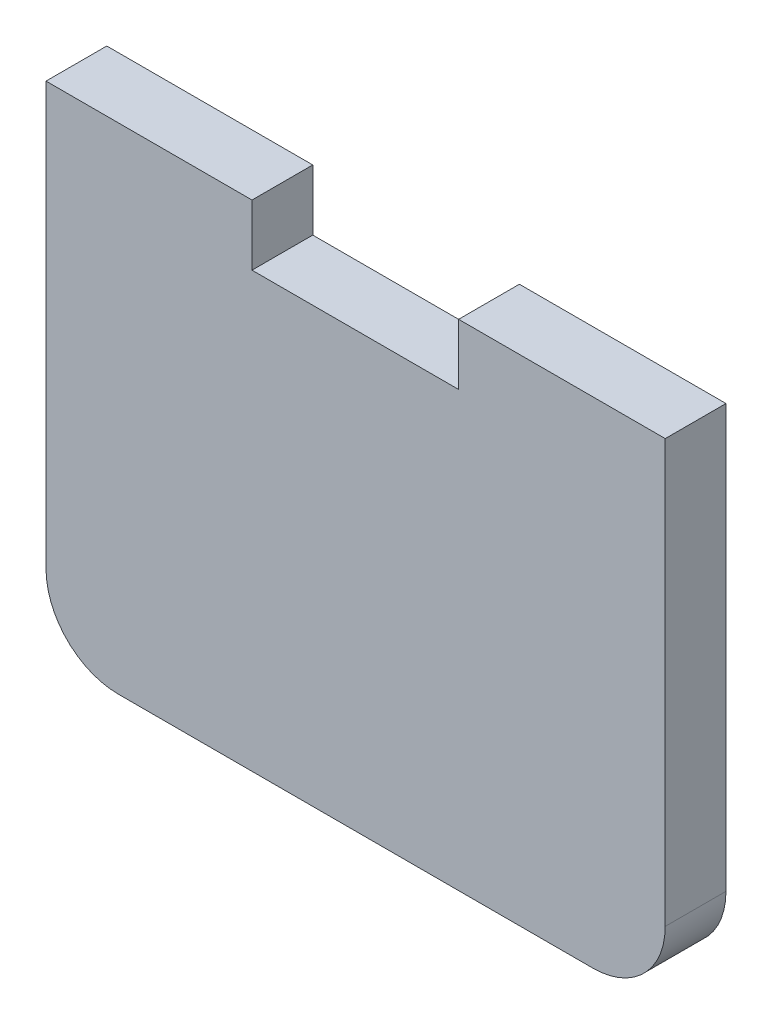
ISO-10303-21;
HEADER;
FILE_DESCRIPTION(('STEP AP214'),'2;1');
FILE_NAME('part.step','',(''),(''),'','','');
FILE_SCHEMA(('AUTOMOTIVE_DESIGN { 1 0 10303 214 1 1 1 1 }'));
ENDSEC;
DATA;
#1=APPLICATION_CONTEXT('core data for automotive mechanical design processes');
#2=APPLICATION_PROTOCOL_DEFINITION('international standard','automotive_design',2000,#1);
#3=PRODUCT_CONTEXT('',#1,'mechanical');
#4=PRODUCT('Part','Part','',(#3));
#5=PRODUCT_RELATED_PRODUCT_CATEGORY('part','',(#4));
#6=PRODUCT_DEFINITION_FORMATION('','',#4);
#7=PRODUCT_DEFINITION_CONTEXT('part definition',#1,'design');
#8=PRODUCT_DEFINITION('design','',#6,#7);
#9=PRODUCT_DEFINITION_SHAPE('','',#8);
#10=(LENGTH_UNIT() NAMED_UNIT(*) SI_UNIT(.MILLI.,.METRE.));
#11=(NAMED_UNIT(*) PLANE_ANGLE_UNIT() SI_UNIT($,.RADIAN.));
#12=(NAMED_UNIT(*) SI_UNIT($,.STERADIAN.) SOLID_ANGLE_UNIT());
#13=UNCERTAINTY_MEASURE_WITH_UNIT(LENGTH_MEASURE(1.E-05),#10,'distance_accuracy_value','');
#14=(GEOMETRIC_REPRESENTATION_CONTEXT(3) GLOBAL_UNCERTAINTY_ASSIGNED_CONTEXT((#13)) GLOBAL_UNIT_ASSIGNED_CONTEXT((#10,
#11,#12)) REPRESENTATION_CONTEXT('',''));
#15=CARTESIAN_POINT('',(0.,0.,0.));
#16=DIRECTION('',(0.,0.,1.));
#17=DIRECTION('',(1.,0.,0.));
#18=AXIS2_PLACEMENT_3D('',#15,#16,#17);
#19=CARTESIAN_POINT('',(-30.5325084704009,25.3111077067274,5.334));
#20=DIRECTION('',(0.,1.,0.));
#21=DIRECTION('',(0.,0.,1.));
#22=AXIS2_PLACEMENT_3D('',#19,#20,#21);
#23=PLANE('',#22);
#24=DIRECTION('',(0.,0.,1.));
#25=VECTOR('',#24,1.);
#26=CARTESIAN_POINT('',(-12.4505750655969,25.3111077067274,0.));
#27=LINE('',#26,#25);
#28=CARTESIAN_POINT('',(-12.4505750655969,25.3111077067274,0.));
#29=VERTEX_POINT('',#28);
#30=CARTESIAN_POINT('',(-12.4505750655969,25.3111077067274,5.334));
#31=VERTEX_POINT('',#30);
#32=EDGE_CURVE('E150',#29,#31,#27,.T.);
#33=ORIENTED_EDGE('',*,*,#32,.F.);
#34=DIRECTION('',(1.,0.,0.));
#35=VECTOR('',#34,1.);
#36=CARTESIAN_POINT('',(-30.5325084704009,25.3111077067274,0.));
#37=LINE('',#36,#35);
#38=CARTESIAN_POINT('',(-30.5325084704009,25.3111077067274,0.));
#39=VERTEX_POINT('',#38);
#40=EDGE_CURVE('E141',#39,#29,#37,.T.);
#41=ORIENTED_EDGE('',*,*,#40,.F.);
#42=DIRECTION('',(0.,0.,-1.));
#43=VECTOR('',#42,1.);
#44=CARTESIAN_POINT('',(-30.5325084704009,25.3111077067274,5.334));
#45=LINE('',#44,#43);
#46=CARTESIAN_POINT('',(-30.5325084704009,25.3111077067274,5.334));
#47=VERTEX_POINT('',#46);
#48=EDGE_CURVE('E167',#47,#39,#45,.T.);
#49=ORIENTED_EDGE('',*,*,#48,.F.);
#50=DIRECTION('',(1.,0.,0.));
#51=VECTOR('',#50,1.);
#52=CARTESIAN_POINT('',(-30.5325084704009,25.3111077067274,5.334));
#53=LINE('',#52,#51);
#54=EDGE_CURVE('E164',#47,#31,#53,.T.);
#55=ORIENTED_EDGE('',*,*,#54,.T.);
#56=EDGE_LOOP('',(#33,#41,#49,#55));
#57=FACE_BOUND('',#56,.T.);
#58=ADVANCED_FACE('F35',(#57),#23,.T.);
#59=CARTESIAN_POINT('',(-30.5325084704009,25.3111077067274,5.334));
#60=DIRECTION('',(1.,0.,0.));
#61=DIRECTION('',(0.,1.,0.));
#62=AXIS2_PLACEMENT_3D('',#59,#60,#61);
#63=PLANE('',#62);
#64=DIRECTION('',(0.,-1.,0.));
#65=VECTOR('',#64,1.);
#66=CARTESIAN_POINT('',(-30.5325084704009,25.3111077067274,0.));
#67=LINE('',#66,#65);
#68=CARTESIAN_POINT('',(-30.5325084704009,-11.7728922932726,0.));
#69=VERTEX_POINT('',#68);
#70=EDGE_CURVE('E152',#39,#69,#67,.T.);
#71=ORIENTED_EDGE('',*,*,#70,.T.);
#72=DIRECTION('',(0.,0.,-1.));
#73=VECTOR('',#72,1.);
#74=CARTESIAN_POINT('',(-30.5325084704009,-11.7728922932726,5.334));
#75=LINE('',#74,#73);
#76=CARTESIAN_POINT('',(-30.5325084704009,-11.7728922932726,5.334));
#77=VERTEX_POINT('',#76);
#78=EDGE_CURVE('E58',#69,#77,#75,.F.);
#79=ORIENTED_EDGE('',*,*,#78,.T.);
#80=DIRECTION('',(0.,-1.,0.));
#81=VECTOR('',#80,1.);
#82=CARTESIAN_POINT('',(-30.5325084704009,25.3111077067274,5.334));
#83=LINE('',#82,#81);
#84=EDGE_CURVE('E157',#47,#77,#83,.T.);
#85=ORIENTED_EDGE('',*,*,#84,.F.);
#86=ORIENTED_EDGE('',*,*,#48,.T.);
#87=EDGE_LOOP('',(#71,#79,#85,#86));
#88=FACE_BOUND('',#87,.T.);
#89=ADVANCED_FACE('F201',(#88),#63,.F.);
#90=CARTESIAN_POINT('',(-30.5325084704009,-18.1228922932726,5.334));
#91=DIRECTION('',(0.,1.,0.));
#92=DIRECTION('',(0.,0.,1.));
#93=AXIS2_PLACEMENT_3D('',#90,#91,#92);
#94=PLANE('',#93);
#95=DIRECTION('',(1.,0.,0.));
#96=VECTOR('',#95,1.);
#97=CARTESIAN_POINT('',(-30.5325084704009,-18.1228922932726,5.334));
#98=LINE('',#97,#96);
#99=CARTESIAN_POINT('',(-24.1825084704009,-18.1228922932726,5.334));
#100=VERTEX_POINT('',#99);
#101=CARTESIAN_POINT('',(17.4734915295991,-18.1228922932726,5.334));
#102=VERTEX_POINT('',#101);
#103=EDGE_CURVE('E159',#100,#102,#98,.T.);
#104=ORIENTED_EDGE('',*,*,#103,.F.);
#105=DIRECTION('',(0.,0.,-1.));
#106=VECTOR('',#105,1.);
#107=CARTESIAN_POINT('',(-24.1825084704009,-18.1228922932726,5.334));
#108=LINE('',#107,#106);
#109=CARTESIAN_POINT('',(-24.1825084704009,-18.1228922932726,0.));
#110=VERTEX_POINT('',#109);
#111=EDGE_CURVE('E183',#100,#110,#108,.T.);
#112=ORIENTED_EDGE('',*,*,#111,.T.);
#113=DIRECTION('',(1.,0.,0.));
#114=VECTOR('',#113,1.);
#115=CARTESIAN_POINT('',(-30.5325084704009,-18.1228922932726,0.));
#116=LINE('',#115,#114);
#117=CARTESIAN_POINT('',(17.4734915295991,-18.1228922932726,0.));
#118=VERTEX_POINT('',#117);
#119=EDGE_CURVE('E169',#110,#118,#116,.T.);
#120=ORIENTED_EDGE('',*,*,#119,.T.);
#121=DIRECTION('',(0.,0.,-1.));
#122=VECTOR('',#121,1.);
#123=CARTESIAN_POINT('',(17.4734915295991,-18.1228922932726,5.334));
#124=LINE('',#123,#122);
#125=EDGE_CURVE('E181',#118,#102,#124,.F.);
#126=ORIENTED_EDGE('',*,*,#125,.T.);
#127=EDGE_LOOP('',(#104,#112,#120,#126));
#128=FACE_BOUND('',#127,.T.);
#129=ADVANCED_FACE('F198',(#128),#94,.F.);
#130=CARTESIAN_POINT('',(23.8234915295991,25.3111077067274,5.334));
#131=DIRECTION('',(1.,0.,0.));
#132=DIRECTION('',(0.,1.,0.));
#133=AXIS2_PLACEMENT_3D('',#130,#131,#132);
#134=PLANE('',#133);
#135=DIRECTION('',(0.,-1.,0.));
#136=VECTOR('',#135,1.);
#137=CARTESIAN_POINT('',(23.8234915295991,25.3111077067274,5.334));
#138=LINE('',#137,#136);
#139=CARTESIAN_POINT('',(23.8234915295991,25.3111077067274,5.334));
#140=VERTEX_POINT('',#139);
#141=CARTESIAN_POINT('',(23.8234915295991,-11.7728922932726,5.334));
#142=VERTEX_POINT('',#141);
#143=EDGE_CURVE('E161',#140,#142,#138,.T.);
#144=ORIENTED_EDGE('',*,*,#143,.T.);
#145=DIRECTION('',(0.,0.,-1.));
#146=VECTOR('',#145,1.);
#147=CARTESIAN_POINT('',(23.8234915295991,-11.7728922932726,0.));
#148=LINE('',#147,#146);
#149=CARTESIAN_POINT('',(23.8234915295991,-11.7728922932726,0.));
#150=VERTEX_POINT('',#149);
#151=EDGE_CURVE('E11',#142,#150,#148,.T.);
#152=ORIENTED_EDGE('',*,*,#151,.T.);
#153=DIRECTION('',(0.,-1.,0.));
#154=VECTOR('',#153,1.);
#155=CARTESIAN_POINT('',(23.8234915295991,25.3111077067274,0.));
#156=LINE('',#155,#154);
#157=CARTESIAN_POINT('',(23.8234915295991,25.3111077067274,0.));
#158=VERTEX_POINT('',#157);
#159=EDGE_CURVE('E172',#158,#150,#156,.T.);
#160=ORIENTED_EDGE('',*,*,#159,.F.);
#161=DIRECTION('',(0.,0.,-1.));
#162=VECTOR('',#161,1.);
#163=CARTESIAN_POINT('',(23.8234915295991,25.3111077067274,5.334));
#164=LINE('',#163,#162);
#165=EDGE_CURVE('E178',#140,#158,#164,.T.);
#166=ORIENTED_EDGE('',*,*,#165,.F.);
#167=EDGE_LOOP('',(#144,#152,#160,#166));
#168=FACE_BOUND('',#167,.T.);
#169=ADVANCED_FACE('F213',(#168),#134,.T.);
#170=DIRECTION('',(0.,0.,1.));
#171=VECTOR('',#170,1.);
#172=CARTESIAN_POINT('',(5.68645823200112,25.3111077067274,0.));
#173=LINE('',#172,#171);
#174=CARTESIAN_POINT('',(5.68645823200112,25.3111077067274,0.));
#175=VERTEX_POINT('',#174);
#176=CARTESIAN_POINT('',(5.68645823200112,25.3111077067274,5.334));
#177=VERTEX_POINT('',#176);
#178=EDGE_CURVE('E153',#175,#177,#173,.T.);
#179=ORIENTED_EDGE('',*,*,#178,.T.);
#180=EDGE_CURVE('E163',#177,#140,#53,.T.);
#181=ORIENTED_EDGE('',*,*,#180,.T.);
#182=ORIENTED_EDGE('',*,*,#165,.T.);
#183=EDGE_CURVE('E175',#175,#158,#37,.T.);
#184=ORIENTED_EDGE('',*,*,#183,.F.);
#185=EDGE_LOOP('',(#179,#181,#182,#184));
#186=FACE_BOUND('',#185,.T.);
#187=ADVANCED_FACE('F209',(#186),#23,.T.);
#188=CARTESIAN_POINT('',(0.,0.,5.334));
#189=DIRECTION('',(0.,0.,1.));
#190=DIRECTION('',(1.,0.,0.));
#191=AXIS2_PLACEMENT_3D('',#188,#189,#190);
#192=PLANE('',#191);
#193=ORIENTED_EDGE('',*,*,#84,.T.);
#194=CARTESIAN_POINT('',(-24.1825084704009,-11.7728922932726,5.334));
#195=DIRECTION('',(0.,0.,1.));
#196=DIRECTION('',(1.,0.,0.));
#197=AXIS2_PLACEMENT_3D('',#194,#195,#196);
#198=CIRCLE('',#197,6.35);
#199=EDGE_CURVE('E43',#77,#100,#198,.T.);
#200=ORIENTED_EDGE('',*,*,#199,.T.);
#201=ORIENTED_EDGE('',*,*,#103,.T.);
#202=CARTESIAN_POINT('',(17.4734915295991,-11.7728922932726,5.334));
#203=DIRECTION('',(0.,0.,1.));
#204=DIRECTION('',(1.,0.,0.));
#205=AXIS2_PLACEMENT_3D('',#202,#203,#204);
#206=CIRCLE('',#205,6.35);
#207=EDGE_CURVE('E50',#102,#142,#206,.T.);
#208=ORIENTED_EDGE('',*,*,#207,.T.);
#209=ORIENTED_EDGE('',*,*,#143,.F.);
#210=ORIENTED_EDGE('',*,*,#180,.F.);
#211=DIRECTION('',(0.,1.,0.));
#212=VECTOR('',#211,1.);
#213=CARTESIAN_POINT('',(5.68645823200112,25.3111077067274,5.334));
#214=LINE('',#213,#212);
#215=CARTESIAN_POINT('',(5.68645823200112,19.9771077067274,5.334));
#216=VERTEX_POINT('',#215);
#217=EDGE_CURVE('E142',#216,#177,#214,.T.);
#218=ORIENTED_EDGE('',*,*,#217,.F.);
#219=DIRECTION('',(1.,0.,0.));
#220=VECTOR('',#219,1.);
#221=CARTESIAN_POINT('',(-12.4505750655969,19.9771077067274,5.334));
#222=LINE('',#221,#220);
#223=CARTESIAN_POINT('',(-12.4505750655969,19.9771077067274,5.334));
#224=VERTEX_POINT('',#223);
#225=EDGE_CURVE('E144',#224,#216,#222,.T.);
#226=ORIENTED_EDGE('',*,*,#225,.F.);
#227=DIRECTION('',(0.,-1.,0.));
#228=VECTOR('',#227,1.);
#229=CARTESIAN_POINT('',(-12.4505750655969,25.3111077067274,5.334));
#230=LINE('',#229,#228);
#231=EDGE_CURVE('E122',#31,#224,#230,.T.);
#232=ORIENTED_EDGE('',*,*,#231,.F.);
#233=ORIENTED_EDGE('',*,*,#54,.F.);
#234=EDGE_LOOP('',(#193,#200,#201,#208,#209,#210,#218,#226,#232,#233));
#235=FACE_BOUND('',#234,.T.);
#236=ADVANCED_FACE('F193',(#235),#192,.T.);
#237=CARTESIAN_POINT('',(0.,0.,0.));
#238=DIRECTION('',(0.,0.,1.));
#239=DIRECTION('',(1.,0.,0.));
#240=AXIS2_PLACEMENT_3D('',#237,#238,#239);
#241=PLANE('',#240);
#242=ORIENTED_EDGE('',*,*,#119,.F.);
#243=CARTESIAN_POINT('',(-24.1825084704009,-11.7728922932726,0.));
#244=DIRECTION('',(0.,0.,1.));
#245=DIRECTION('',(1.,0.,0.));
#246=AXIS2_PLACEMENT_3D('',#243,#244,#245);
#247=CIRCLE('',#246,6.35);
#248=EDGE_CURVE('E188',#110,#69,#247,.F.);
#249=ORIENTED_EDGE('',*,*,#248,.T.);
#250=ORIENTED_EDGE('',*,*,#70,.F.);
#251=ORIENTED_EDGE('',*,*,#40,.T.);
#252=DIRECTION('',(0.,-1.,0.));
#253=VECTOR('',#252,1.);
#254=CARTESIAN_POINT('',(-12.4505750655969,25.3111077067274,0.));
#255=LINE('',#254,#253);
#256=CARTESIAN_POINT('',(-12.4505750655969,19.9771077067274,0.));
#257=VERTEX_POINT('',#256);
#258=EDGE_CURVE('E119',#29,#257,#255,.T.);
#259=ORIENTED_EDGE('',*,*,#258,.T.);
#260=DIRECTION('',(1.,0.,0.));
#261=VECTOR('',#260,1.);
#262=CARTESIAN_POINT('',(-12.4505750655969,19.9771077067274,0.));
#263=LINE('',#262,#261);
#264=CARTESIAN_POINT('',(5.68645823200112,19.9771077067274,0.));
#265=VERTEX_POINT('',#264);
#266=EDGE_CURVE('E131',#257,#265,#263,.T.);
#267=ORIENTED_EDGE('',*,*,#266,.T.);
#268=DIRECTION('',(0.,1.,0.));
#269=VECTOR('',#268,1.);
#270=CARTESIAN_POINT('',(5.68645823200112,25.3111077067274,0.));
#271=LINE('',#270,#269);
#272=EDGE_CURVE('E127',#265,#175,#271,.T.);
#273=ORIENTED_EDGE('',*,*,#272,.T.);
#274=ORIENTED_EDGE('',*,*,#183,.T.);
#275=ORIENTED_EDGE('',*,*,#159,.T.);
#276=CARTESIAN_POINT('',(17.4734915295991,-11.7728922932726,0.));
#277=DIRECTION('',(0.,0.,1.));
#278=DIRECTION('',(1.,0.,0.));
#279=AXIS2_PLACEMENT_3D('',#276,#277,#278);
#280=CIRCLE('',#279,6.35);
#281=EDGE_CURVE('E186',#150,#118,#280,.F.);
#282=ORIENTED_EDGE('',*,*,#281,.T.);
#283=EDGE_LOOP('',(#242,#249,#250,#251,#259,#267,#273,#274,#275,#282));
#284=FACE_BOUND('',#283,.T.);
#285=ADVANCED_FACE('F138',(#284),#241,.F.);
#286=CARTESIAN_POINT('',(-12.4505750655969,25.3111077067274,0.));
#287=DIRECTION('',(-1.,0.,0.));
#288=DIRECTION('',(0.,0.,1.));
#289=AXIS2_PLACEMENT_3D('',#286,#287,#288);
#290=PLANE('',#289);
#291=ORIENTED_EDGE('',*,*,#231,.T.);
#292=DIRECTION('',(0.,0.,1.));
#293=VECTOR('',#292,1.);
#294=CARTESIAN_POINT('',(-12.4505750655969,19.9771077067274,0.));
#295=LINE('',#294,#293);
#296=EDGE_CURVE('E115',#257,#224,#295,.T.);
#297=ORIENTED_EDGE('',*,*,#296,.F.);
#298=ORIENTED_EDGE('',*,*,#258,.F.);
#299=ORIENTED_EDGE('',*,*,#32,.T.);
#300=EDGE_LOOP('',(#291,#297,#298,#299));
#301=FACE_BOUND('',#300,.T.);
#302=ADVANCED_FACE('F117',(#301),#290,.F.);
#303=CARTESIAN_POINT('',(5.68645823200112,25.3111077067274,0.));
#304=DIRECTION('',(1.,0.,0.));
#305=DIRECTION('',(0.,0.,-1.));
#306=AXIS2_PLACEMENT_3D('',#303,#304,#305);
#307=PLANE('',#306);
#308=ORIENTED_EDGE('',*,*,#217,.T.);
#309=ORIENTED_EDGE('',*,*,#178,.F.);
#310=ORIENTED_EDGE('',*,*,#272,.F.);
#311=DIRECTION('',(0.,0.,1.));
#312=VECTOR('',#311,1.);
#313=CARTESIAN_POINT('',(5.68645823200112,19.9771077067274,0.));
#314=LINE('',#313,#312);
#315=EDGE_CURVE('E126',#265,#216,#314,.T.);
#316=ORIENTED_EDGE('',*,*,#315,.T.);
#317=EDGE_LOOP('',(#308,#309,#310,#316));
#318=FACE_BOUND('',#317,.T.);
#319=ADVANCED_FACE('F206',(#318),#307,.F.);
#320=CARTESIAN_POINT('',(-12.4505750655969,19.9771077067274,0.));
#321=DIRECTION('',(0.,-1.,0.));
#322=DIRECTION('',(0.,0.,-1.));
#323=AXIS2_PLACEMENT_3D('',#320,#321,#322);
#324=PLANE('',#323);
#325=ORIENTED_EDGE('',*,*,#225,.T.);
#326=ORIENTED_EDGE('',*,*,#315,.F.);
#327=ORIENTED_EDGE('',*,*,#266,.F.);
#328=ORIENTED_EDGE('',*,*,#296,.T.);
#329=EDGE_LOOP('',(#325,#326,#327,#328));
#330=FACE_BOUND('',#329,.T.);
#331=ADVANCED_FACE('F132',(#330),#324,.F.);
#332=CARTESIAN_POINT('',(-24.1825084704009,-11.7728922932726,5.334));
#333=DIRECTION('',(0.,0.,-1.));
#334=DIRECTION('',(-1.,0.,0.));
#335=AXIS2_PLACEMENT_3D('',#332,#333,#334);
#336=CYLINDRICAL_SURFACE('',#335,6.35);
#337=ORIENTED_EDGE('',*,*,#199,.F.);
#338=ORIENTED_EDGE('',*,*,#78,.F.);
#339=ORIENTED_EDGE('',*,*,#248,.F.);
#340=ORIENTED_EDGE('',*,*,#111,.F.);
#341=EDGE_LOOP('',(#337,#338,#339,#340));
#342=FACE_BOUND('',#341,.T.);
#343=ADVANCED_FACE('F200',(#342),#336,.T.);
#344=CARTESIAN_POINT('',(17.4734915295991,-11.7728922932726,5.334));
#345=DIRECTION('',(0.,0.,1.));
#346=DIRECTION('',(1.,0.,0.));
#347=AXIS2_PLACEMENT_3D('',#344,#345,#346);
#348=CYLINDRICAL_SURFACE('',#347,6.35);
#349=ORIENTED_EDGE('',*,*,#207,.F.);
#350=ORIENTED_EDGE('',*,*,#125,.F.);
#351=ORIENTED_EDGE('',*,*,#281,.F.);
#352=ORIENTED_EDGE('',*,*,#151,.F.);
#353=EDGE_LOOP('',(#349,#350,#351,#352));
#354=FACE_BOUND('',#353,.T.);
#355=ADVANCED_FACE('F37',(#354),#348,.T.);
#356=CLOSED_SHELL('',(#58,#89,#129,#169,#187,#236,#285,#302,#319,#331,#343,#355));
#357=MANIFOLD_SOLID_BREP('B2',#356);
#358=ADVANCED_BREP_SHAPE_REPRESENTATION('',(#18,#357),#14);
#359=SHAPE_DEFINITION_REPRESENTATION(#9,#358);
ENDSEC;
END-ISO-10303-21;
